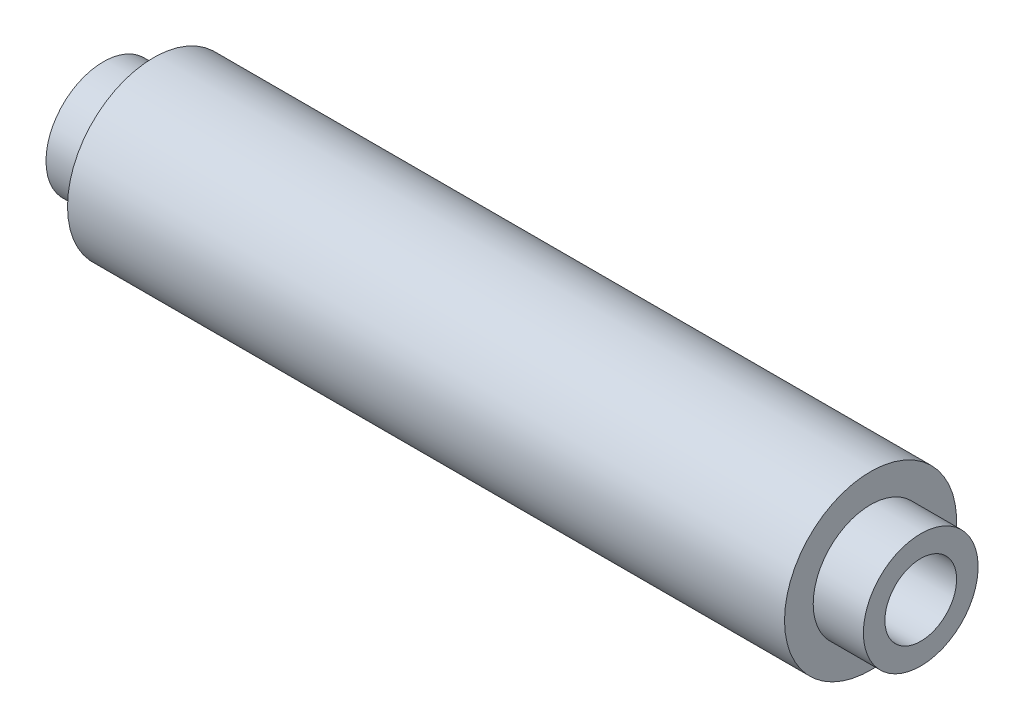
ISO-10303-21;
HEADER;
FILE_DESCRIPTION(('STEP AP214'),'2;1');
FILE_NAME('part.step','',(''),(''),'','','');
FILE_SCHEMA(('AUTOMOTIVE_DESIGN { 1 0 10303 214 1 1 1 1 }'));
ENDSEC;
DATA;
#1=APPLICATION_CONTEXT('core data for automotive mechanical design processes');
#2=APPLICATION_PROTOCOL_DEFINITION('international standard','automotive_design',2000,#1);
#3=PRODUCT_CONTEXT('',#1,'mechanical');
#4=PRODUCT('Part','Part','',(#3));
#5=PRODUCT_RELATED_PRODUCT_CATEGORY('part','',(#4));
#6=PRODUCT_DEFINITION_FORMATION('','',#4);
#7=PRODUCT_DEFINITION_CONTEXT('part definition',#1,'design');
#8=PRODUCT_DEFINITION('design','',#6,#7);
#9=PRODUCT_DEFINITION_SHAPE('','',#8);
#10=(LENGTH_UNIT() NAMED_UNIT(*) SI_UNIT(.MILLI.,.METRE.));
#11=(NAMED_UNIT(*) PLANE_ANGLE_UNIT() SI_UNIT($,.RADIAN.));
#12=(NAMED_UNIT(*) SI_UNIT($,.STERADIAN.) SOLID_ANGLE_UNIT());
#13=UNCERTAINTY_MEASURE_WITH_UNIT(LENGTH_MEASURE(1.E-05),#10,'distance_accuracy_value','');
#14=(GEOMETRIC_REPRESENTATION_CONTEXT(3) GLOBAL_UNCERTAINTY_ASSIGNED_CONTEXT((#13)) GLOBAL_UNIT_ASSIGNED_CONTEXT((#10,
#11,#12)) REPRESENTATION_CONTEXT('',''));
#15=CARTESIAN_POINT('',(0.,0.,0.));
#16=DIRECTION('',(0.,0.,1.));
#17=DIRECTION('',(1.,0.,0.));
#18=AXIS2_PLACEMENT_3D('',#15,#16,#17);
#19=CARTESIAN_POINT('',(0.,4.,0.));
#20=DIRECTION('',(1.,0.,0.));
#21=DIRECTION('',(0.,0.,-1.));
#22=AXIS2_PLACEMENT_3D('',#19,#20,#21);
#23=PLANE('',#22);
#24=CARTESIAN_POINT('',(0.,0.,0.));
#25=DIRECTION('',(-1.,0.,0.));
#26=DIRECTION('',(0.,0.,1.));
#27=AXIS2_PLACEMENT_3D('',#24,#25,#26);
#28=CIRCLE('',#27,2.5);
#29=CARTESIAN_POINT('',(0.,0.,2.5));
#30=VERTEX_POINT('',#29);
#31=EDGE_CURVE('E10',#30,#30,#28,.T.);
#32=ORIENTED_EDGE('',*,*,#31,.F.);
#33=EDGE_LOOP('',(#32));
#34=FACE_BOUND('',#33,.T.);
#35=CARTESIAN_POINT('',(0.,0.,0.));
#36=DIRECTION('',(-1.,0.,0.));
#37=DIRECTION('',(0.,0.,1.));
#38=AXIS2_PLACEMENT_3D('',#35,#36,#37);
#39=CIRCLE('',#38,4.);
#40=CARTESIAN_POINT('',(0.,0.,4.));
#41=VERTEX_POINT('',#40);
#42=EDGE_CURVE('E70',#41,#41,#39,.T.);
#43=ORIENTED_EDGE('',*,*,#42,.T.);
#44=EDGE_LOOP('',(#43));
#45=FACE_BOUND('',#44,.T.);
#46=ADVANCED_FACE('F36',(#34,#45),#23,.F.);
#47=CARTESIAN_POINT('',(0.,0.,0.));
#48=DIRECTION('',(-1.,0.,0.));
#49=DIRECTION('',(0.,0.,1.));
#50=AXIS2_PLACEMENT_3D('',#47,#48,#49);
#51=CYLINDRICAL_SURFACE('',#50,2.5);
#52=CARTESIAN_POINT('',(20.,0.,0.));
#53=DIRECTION('',(-1.,0.,0.));
#54=DIRECTION('',(0.,0.,1.));
#55=AXIS2_PLACEMENT_3D('',#52,#53,#54);
#56=CIRCLE('',#55,2.5);
#57=CARTESIAN_POINT('',(20.,0.,2.5));
#58=VERTEX_POINT('',#57);
#59=EDGE_CURVE('E42',#58,#58,#56,.T.);
#60=ORIENTED_EDGE('',*,*,#59,.F.);
#61=EDGE_LOOP('',(#60));
#62=FACE_BOUND('',#61,.T.);
#63=ORIENTED_EDGE('',*,*,#31,.T.);
#64=EDGE_LOOP('',(#63));
#65=FACE_BOUND('',#64,.T.);
#66=ADVANCED_FACE('F124',(#62,#65),#51,.F.);
#67=CARTESIAN_POINT('',(20.,2.5,0.));
#68=DIRECTION('',(1.,0.,0.));
#69=DIRECTION('',(0.,0.,-1.));
#70=AXIS2_PLACEMENT_3D('',#67,#68,#69);
#71=PLANE('',#70);
#72=ORIENTED_EDGE('',*,*,#59,.T.);
#73=EDGE_LOOP('',(#72));
#74=FACE_BOUND('',#73,.T.);
#75=ADVANCED_FACE('F119',(#74),#71,.F.);
#76=CARTESIAN_POINT('',(37.,0.,0.));
#77=DIRECTION('',(-1.,0.,0.));
#78=DIRECTION('',(0.,0.,1.));
#79=AXIS2_PLACEMENT_3D('',#76,#77,#78);
#80=PLANE('',#79);
#81=CARTESIAN_POINT('',(37.,0.,0.));
#82=DIRECTION('',(-1.,0.,0.));
#83=DIRECTION('',(0.,0.,1.));
#84=AXIS2_PLACEMENT_3D('',#81,#82,#83);
#85=CIRCLE('',#84,2.5);
#86=CARTESIAN_POINT('',(37.,0.,2.5));
#87=VERTEX_POINT('',#86);
#88=EDGE_CURVE('E46',#87,#87,#85,.T.);
#89=ORIENTED_EDGE('',*,*,#88,.F.);
#90=EDGE_LOOP('',(#89));
#91=FACE_BOUND('',#90,.T.);
#92=ADVANCED_FACE('F114',(#91),#80,.F.);
#93=CARTESIAN_POINT('',(0.,0.,0.));
#94=DIRECTION('',(-1.,0.,0.));
#95=DIRECTION('',(0.,0.,1.));
#96=AXIS2_PLACEMENT_3D('',#93,#94,#95);
#97=CYLINDRICAL_SURFACE('',#96,2.5);
#98=CARTESIAN_POINT('',(57.,0.,0.));
#99=DIRECTION('',(-1.,0.,0.));
#100=DIRECTION('',(0.,0.,1.));
#101=AXIS2_PLACEMENT_3D('',#98,#99,#100);
#102=CIRCLE('',#101,2.5);
#103=CARTESIAN_POINT('',(57.,0.,2.5));
#104=VERTEX_POINT('',#103);
#105=EDGE_CURVE('E50',#104,#104,#102,.T.);
#106=ORIENTED_EDGE('',*,*,#105,.F.);
#107=EDGE_LOOP('',(#106));
#108=FACE_BOUND('',#107,.T.);
#109=ORIENTED_EDGE('',*,*,#88,.T.);
#110=EDGE_LOOP('',(#109));
#111=FACE_BOUND('',#110,.T.);
#112=ADVANCED_FACE('F108',(#108,#111),#97,.F.);
#113=CARTESIAN_POINT('',(57.,2.5,0.));
#114=DIRECTION('',(-1.,0.,0.));
#115=DIRECTION('',(0.,0.,1.));
#116=AXIS2_PLACEMENT_3D('',#113,#114,#115);
#117=PLANE('',#116);
#118=CARTESIAN_POINT('',(57.,0.,0.));
#119=DIRECTION('',(-1.,0.,0.));
#120=DIRECTION('',(0.,0.,1.));
#121=AXIS2_PLACEMENT_3D('',#118,#119,#120);
#122=CIRCLE('',#121,4.00000000000001);
#123=CARTESIAN_POINT('',(57.,0.,4.00000000000001));
#124=VERTEX_POINT('',#123);
#125=EDGE_CURVE('E55',#124,#124,#122,.T.);
#126=ORIENTED_EDGE('',*,*,#125,.F.);
#127=EDGE_LOOP('',(#126));
#128=FACE_BOUND('',#127,.T.);
#129=ORIENTED_EDGE('',*,*,#105,.T.);
#130=EDGE_LOOP('',(#129));
#131=FACE_BOUND('',#130,.T.);
#132=ADVANCED_FACE('F102',(#128,#131),#117,.F.);
#133=CARTESIAN_POINT('',(0.,0.,0.));
#134=DIRECTION('',(-1.,0.,0.));
#135=DIRECTION('',(0.,0.,1.));
#136=AXIS2_PLACEMENT_3D('',#133,#134,#135);
#137=CYLINDRICAL_SURFACE('',#136,4.00000000000001);
#138=CARTESIAN_POINT('',(53.5,0.,0.));
#139=DIRECTION('',(-1.,0.,0.));
#140=DIRECTION('',(0.,0.,1.));
#141=AXIS2_PLACEMENT_3D('',#138,#139,#140);
#142=CIRCLE('',#141,4.00000000000002);
#143=CARTESIAN_POINT('',(53.5,0.,4.00000000000002));
#144=VERTEX_POINT('',#143);
#145=EDGE_CURVE('E58',#144,#144,#142,.T.);
#146=ORIENTED_EDGE('',*,*,#145,.F.);
#147=EDGE_LOOP('',(#146));
#148=FACE_BOUND('',#147,.T.);
#149=ORIENTED_EDGE('',*,*,#125,.T.);
#150=EDGE_LOOP('',(#149));
#151=FACE_BOUND('',#150,.T.);
#152=ADVANCED_FACE('F96',(#148,#151),#137,.T.);
#153=CARTESIAN_POINT('',(53.5,4.00000000000002,0.));
#154=DIRECTION('',(-1.,0.,0.));
#155=DIRECTION('',(0.,0.,1.));
#156=AXIS2_PLACEMENT_3D('',#153,#154,#155);
#157=PLANE('',#156);
#158=CARTESIAN_POINT('',(53.5,0.,0.));
#159=DIRECTION('',(-1.,0.,0.));
#160=DIRECTION('',(0.,0.,1.));
#161=AXIS2_PLACEMENT_3D('',#158,#159,#160);
#162=CIRCLE('',#161,6.00000000000001);
#163=CARTESIAN_POINT('',(53.5,0.,6.00000000000001));
#164=VERTEX_POINT('',#163);
#165=EDGE_CURVE('E61',#164,#164,#162,.T.);
#166=ORIENTED_EDGE('',*,*,#165,.F.);
#167=EDGE_LOOP('',(#166));
#168=FACE_BOUND('',#167,.T.);
#169=ORIENTED_EDGE('',*,*,#145,.T.);
#170=EDGE_LOOP('',(#169));
#171=FACE_BOUND('',#170,.T.);
#172=ADVANCED_FACE('F90',(#168,#171),#157,.F.);
#173=CARTESIAN_POINT('',(0.,0.,0.));
#174=DIRECTION('',(-1.,0.,0.));
#175=DIRECTION('',(0.,0.,1.));
#176=AXIS2_PLACEMENT_3D('',#173,#174,#175);
#177=CYLINDRICAL_SURFACE('',#176,6.);
#178=CARTESIAN_POINT('',(3.5,0.,0.));
#179=DIRECTION('',(-1.,0.,0.));
#180=DIRECTION('',(0.,0.,1.));
#181=AXIS2_PLACEMENT_3D('',#178,#179,#180);
#182=CIRCLE('',#181,5.99999999999999);
#183=CARTESIAN_POINT('',(3.5,0.,5.99999999999999));
#184=VERTEX_POINT('',#183);
#185=EDGE_CURVE('E64',#184,#184,#182,.T.);
#186=ORIENTED_EDGE('',*,*,#185,.F.);
#187=EDGE_LOOP('',(#186));
#188=FACE_BOUND('',#187,.T.);
#189=ORIENTED_EDGE('',*,*,#165,.T.);
#190=EDGE_LOOP('',(#189));
#191=FACE_BOUND('',#190,.T.);
#192=ADVANCED_FACE('F84',(#188,#191),#177,.T.);
#193=CARTESIAN_POINT('',(3.5,5.99999999999999,0.));
#194=DIRECTION('',(1.,0.,0.));
#195=DIRECTION('',(0.,0.,-1.));
#196=AXIS2_PLACEMENT_3D('',#193,#194,#195);
#197=PLANE('',#196);
#198=CARTESIAN_POINT('',(3.5,0.,0.));
#199=DIRECTION('',(-1.,0.,0.));
#200=DIRECTION('',(0.,0.,1.));
#201=AXIS2_PLACEMENT_3D('',#198,#199,#200);
#202=CIRCLE('',#201,4.);
#203=CARTESIAN_POINT('',(3.5,0.,4.));
#204=VERTEX_POINT('',#203);
#205=EDGE_CURVE('E67',#204,#204,#202,.T.);
#206=ORIENTED_EDGE('',*,*,#205,.F.);
#207=EDGE_LOOP('',(#206));
#208=FACE_BOUND('',#207,.T.);
#209=ORIENTED_EDGE('',*,*,#185,.T.);
#210=EDGE_LOOP('',(#209));
#211=FACE_BOUND('',#210,.T.);
#212=ADVANCED_FACE('F78',(#208,#211),#197,.F.);
#213=CARTESIAN_POINT('',(0.,0.,0.));
#214=DIRECTION('',(-1.,0.,0.));
#215=DIRECTION('',(0.,0.,1.));
#216=AXIS2_PLACEMENT_3D('',#213,#214,#215);
#217=CYLINDRICAL_SURFACE('',#216,4.);
#218=ORIENTED_EDGE('',*,*,#42,.F.);
#219=EDGE_LOOP('',(#218));
#220=FACE_BOUND('',#219,.T.);
#221=ORIENTED_EDGE('',*,*,#205,.T.);
#222=EDGE_LOOP('',(#221));
#223=FACE_BOUND('',#222,.T.);
#224=ADVANCED_FACE('F75',(#220,#223),#217,.T.);
#225=CLOSED_SHELL('',(#46,#66,#75,#92,#112,#132,#152,#172,#192,#212,#224));
#226=MANIFOLD_SOLID_BREP('B2',#225);
#227=ADVANCED_BREP_SHAPE_REPRESENTATION('',(#18,#226),#14);
#228=SHAPE_DEFINITION_REPRESENTATION(#9,#227);
ENDSEC;
END-ISO-10303-21;
